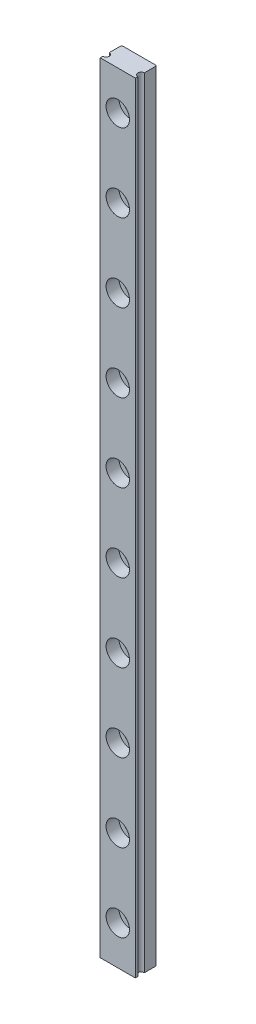
ISO-10303-21;
HEADER;
FILE_DESCRIPTION(('STEP AP214'),'2;1');
FILE_NAME('part.step','',(''),(''),'','','');
FILE_SCHEMA(('AUTOMOTIVE_DESIGN { 1 0 10303 214 1 1 1 1 }'));
ENDSEC;
DATA;
#1=APPLICATION_CONTEXT('core data for automotive mechanical design processes');
#2=APPLICATION_PROTOCOL_DEFINITION('international standard','automotive_design',2000,#1);
#3=PRODUCT_CONTEXT('',#1,'mechanical');
#4=PRODUCT('Part','Part','',(#3));
#5=PRODUCT_RELATED_PRODUCT_CATEGORY('part','',(#4));
#6=PRODUCT_DEFINITION_FORMATION('','',#4);
#7=PRODUCT_DEFINITION_CONTEXT('part definition',#1,'design');
#8=PRODUCT_DEFINITION('design','',#6,#7);
#9=PRODUCT_DEFINITION_SHAPE('','',#8);
#10=(LENGTH_UNIT() NAMED_UNIT(*) SI_UNIT(.MILLI.,.METRE.));
#11=(NAMED_UNIT(*) PLANE_ANGLE_UNIT() SI_UNIT($,.RADIAN.));
#12=(NAMED_UNIT(*) SI_UNIT($,.STERADIAN.) SOLID_ANGLE_UNIT());
#13=UNCERTAINTY_MEASURE_WITH_UNIT(LENGTH_MEASURE(1.E-05),#10,'distance_accuracy_value','');
#14=(GEOMETRIC_REPRESENTATION_CONTEXT(3) GLOBAL_UNCERTAINTY_ASSIGNED_CONTEXT((#13)) GLOBAL_UNIT_ASSIGNED_CONTEXT((#10,
#11,#12)) REPRESENTATION_CONTEXT('',''));
#15=CARTESIAN_POINT('',(0.,0.,0.));
#16=DIRECTION('',(0.,0.,1.));
#17=DIRECTION('',(1.,0.,0.));
#18=AXIS2_PLACEMENT_3D('',#15,#16,#17);
#19=CARTESIAN_POINT('',(-4.5,-120.,5.1625));
#20=DIRECTION('',(-1.,0.,0.));
#21=DIRECTION('',(0.,0.,1.));
#22=AXIS2_PLACEMENT_3D('',#19,#20,#21);
#23=PLANE('',#22);
#24=DIRECTION('',(0.,1.,0.));
#25=VECTOR('',#24,1.);
#26=CARTESIAN_POINT('',(-4.5,-120.,5.5));
#27=LINE('',#26,#25);
#28=CARTESIAN_POINT('',(-4.5,-120.,5.5));
#29=VERTEX_POINT('',#28);
#30=CARTESIAN_POINT('',(-4.5,80.,5.5));
#31=VERTEX_POINT('',#30);
#32=EDGE_CURVE('E287',#29,#31,#27,.T.);
#33=ORIENTED_EDGE('',*,*,#32,.T.);
#34=DIRECTION('',(0.,0.,-1.));
#35=VECTOR('',#34,1.);
#36=CARTESIAN_POINT('',(-4.5,80.,5.1625));
#37=LINE('',#36,#35);
#38=CARTESIAN_POINT('',(-4.5,80.,4.825));
#39=VERTEX_POINT('',#38);
#40=EDGE_CURVE('E325',#31,#39,#37,.T.);
#41=ORIENTED_EDGE('',*,*,#40,.T.);
#42=DIRECTION('',(0.,1.,0.));
#43=VECTOR('',#42,1.);
#44=CARTESIAN_POINT('',(-4.5,-120.,4.825));
#45=LINE('',#44,#43);
#46=CARTESIAN_POINT('',(-4.5,-120.,4.825));
#47=VERTEX_POINT('',#46);
#48=EDGE_CURVE('E214',#47,#39,#45,.T.);
#49=ORIENTED_EDGE('',*,*,#48,.F.);
#50=DIRECTION('',(0.,0.,-1.));
#51=VECTOR('',#50,1.);
#52=CARTESIAN_POINT('',(-4.5,-120.,5.1625));
#53=LINE('',#52,#51);
#54=EDGE_CURVE('E286',#29,#47,#53,.T.);
#55=ORIENTED_EDGE('',*,*,#54,.F.);
#56=EDGE_LOOP('',(#33,#41,#49,#55));
#57=FACE_BOUND('',#56,.T.);
#58=ADVANCED_FACE('F36',(#57),#23,.T.);
#59=CARTESIAN_POINT('',(-4.5,-120.,4.));
#60=DIRECTION('',(0.,1.,0.));
#61=DIRECTION('',(0.,0.,1.));
#62=AXIS2_PLACEMENT_3D('',#59,#60,#61);
#63=CYLINDRICAL_SURFACE('',#62,0.825);
#64=CARTESIAN_POINT('',(-4.5,80.,4.));
#65=DIRECTION('',(0.,1.,0.));
#66=DIRECTION('',(0.,0.,1.));
#67=AXIS2_PLACEMENT_3D('',#64,#65,#66);
#68=CIRCLE('',#67,0.825);
#69=CARTESIAN_POINT('',(-4.5,80.,3.175));
#70=VERTEX_POINT('',#69);
#71=EDGE_CURVE('E350',#70,#39,#68,.F.);
#72=ORIENTED_EDGE('',*,*,#71,.F.);
#73=DIRECTION('',(0.,1.,0.));
#74=VECTOR('',#73,1.);
#75=CARTESIAN_POINT('',(-4.5,-120.,3.175));
#76=LINE('',#75,#74);
#77=CARTESIAN_POINT('',(-4.5,-120.,3.175));
#78=VERTEX_POINT('',#77);
#79=EDGE_CURVE('E320',#78,#70,#76,.T.);
#80=ORIENTED_EDGE('',*,*,#79,.F.);
#81=CARTESIAN_POINT('',(-4.5,-120.,4.));
#82=DIRECTION('',(0.,1.,0.));
#83=DIRECTION('',(0.,0.,-1.));
#84=AXIS2_PLACEMENT_3D('',#81,#82,#83);
#85=CIRCLE('',#84,0.825);
#86=EDGE_CURVE('E292',#47,#78,#85,.T.);
#87=ORIENTED_EDGE('',*,*,#86,.F.);
#88=ORIENTED_EDGE('',*,*,#48,.T.);
#89=EDGE_LOOP('',(#72,#80,#87,#88));
#90=FACE_BOUND('',#89,.T.);
#91=ADVANCED_FACE('F409',(#90),#63,.F.);
#92=CARTESIAN_POINT('',(-4.5,-120.,1.7125));
#93=DIRECTION('',(-1.,0.,0.));
#94=DIRECTION('',(0.,0.,1.));
#95=AXIS2_PLACEMENT_3D('',#92,#93,#94);
#96=PLANE('',#95);
#97=ORIENTED_EDGE('',*,*,#79,.T.);
#98=DIRECTION('',(0.,0.,-1.));
#99=VECTOR('',#98,1.);
#100=CARTESIAN_POINT('',(-4.5,80.,1.7125));
#101=LINE('',#100,#99);
#102=CARTESIAN_POINT('',(-4.5,80.,0.249999999999999));
#103=VERTEX_POINT('',#102);
#104=EDGE_CURVE('E353',#70,#103,#101,.T.);
#105=ORIENTED_EDGE('',*,*,#104,.T.);
#106=DIRECTION('',(0.,1.,0.));
#107=VECTOR('',#106,1.);
#108=CARTESIAN_POINT('',(-4.5,-120.,0.25));
#109=LINE('',#108,#107);
#110=CARTESIAN_POINT('',(-4.5,-120.,0.25));
#111=VERTEX_POINT('',#110);
#112=EDGE_CURVE('E295',#111,#103,#109,.T.);
#113=ORIENTED_EDGE('',*,*,#112,.F.);
#114=DIRECTION('',(0.,0.,-1.));
#115=VECTOR('',#114,1.);
#116=CARTESIAN_POINT('',(-4.5,-120.,1.7125));
#117=LINE('',#116,#115);
#118=EDGE_CURVE('E296',#78,#111,#117,.T.);
#119=ORIENTED_EDGE('',*,*,#118,.F.);
#120=EDGE_LOOP('',(#97,#105,#113,#119));
#121=FACE_BOUND('',#120,.T.);
#122=ADVANCED_FACE('F403',(#121),#96,.T.);
#123=CARTESIAN_POINT('',(-4.375,-120.,0.125));
#124=DIRECTION('',(-0.707106781186548,0.,-0.707106781186547));
#125=DIRECTION('',(-0.707106781186547,0.,0.707106781186548));
#126=AXIS2_PLACEMENT_3D('',#123,#124,#125);
#127=PLANE('',#126);
#128=ORIENTED_EDGE('',*,*,#112,.T.);
#129=DIRECTION('',(0.707106781186547,0.,-0.707106781186548));
#130=VECTOR('',#129,1.);
#131=CARTESIAN_POINT('',(-4.375,80.,0.125));
#132=LINE('',#131,#130);
#133=CARTESIAN_POINT('',(-4.25,80.,0.));
#134=VERTEX_POINT('',#133);
#135=EDGE_CURVE('E356',#103,#134,#132,.T.);
#136=ORIENTED_EDGE('',*,*,#135,.T.);
#137=DIRECTION('',(0.,1.,0.));
#138=VECTOR('',#137,1.);
#139=CARTESIAN_POINT('',(-4.25,-120.,0.));
#140=LINE('',#139,#138);
#141=CARTESIAN_POINT('',(-4.25,-120.,0.));
#142=VERTEX_POINT('',#141);
#143=EDGE_CURVE('E230',#142,#134,#140,.T.);
#144=ORIENTED_EDGE('',*,*,#143,.F.);
#145=DIRECTION('',(0.707106781186547,0.,-0.707106781186548));
#146=VECTOR('',#145,1.);
#147=CARTESIAN_POINT('',(-4.375,-120.,0.125));
#148=LINE('',#147,#146);
#149=EDGE_CURVE('E293',#111,#142,#148,.T.);
#150=ORIENTED_EDGE('',*,*,#149,.F.);
#151=EDGE_LOOP('',(#128,#136,#144,#150));
#152=FACE_BOUND('',#151,.T.);
#153=ADVANCED_FACE('F397',(#152),#127,.T.);
#154=CARTESIAN_POINT('',(2.25,-120.,5.5));
#155=DIRECTION('',(0.,0.,1.));
#156=DIRECTION('',(1.,0.,0.));
#157=AXIS2_PLACEMENT_3D('',#154,#155,#156);
#158=PLANE('',#157);
#159=CARTESIAN_POINT('',(0.,70.,5.5));
#160=DIRECTION('',(0.,0.,-1.));
#161=DIRECTION('',(-1.,0.,0.));
#162=AXIS2_PLACEMENT_3D('',#159,#160,#161);
#163=CIRCLE('',#162,3.);
#164=CARTESIAN_POINT('',(-3.,70.,5.5));
#165=VERTEX_POINT('',#164);
#166=EDGE_CURVE('E315',#165,#165,#163,.T.);
#167=ORIENTED_EDGE('',*,*,#166,.T.);
#168=EDGE_LOOP('',(#167));
#169=FACE_BOUND('',#168,.T.);
#170=CARTESIAN_POINT('',(0.,50.,5.5));
#171=DIRECTION('',(0.,0.,-1.));
#172=DIRECTION('',(-1.,0.,0.));
#173=AXIS2_PLACEMENT_3D('',#170,#171,#172);
#174=CIRCLE('',#173,3.);
#175=CARTESIAN_POINT('',(-3.,50.,5.5));
#176=VERTEX_POINT('',#175);
#177=EDGE_CURVE('E218',#176,#176,#174,.T.);
#178=ORIENTED_EDGE('',*,*,#177,.T.);
#179=EDGE_LOOP('',(#178));
#180=FACE_BOUND('',#179,.T.);
#181=CARTESIAN_POINT('',(0.,30.,5.5));
#182=DIRECTION('',(0.,0.,-1.));
#183=DIRECTION('',(-1.,0.,0.));
#184=AXIS2_PLACEMENT_3D('',#181,#182,#183);
#185=CIRCLE('',#184,3.);
#186=CARTESIAN_POINT('',(-3.,30.,5.5));
#187=VERTEX_POINT('',#186);
#188=EDGE_CURVE('E210',#187,#187,#185,.T.);
#189=ORIENTED_EDGE('',*,*,#188,.T.);
#190=EDGE_LOOP('',(#189));
#191=FACE_BOUND('',#190,.T.);
#192=CARTESIAN_POINT('',(0.,10.,5.5));
#193=DIRECTION('',(0.,0.,-1.));
#194=DIRECTION('',(-1.,0.,0.));
#195=AXIS2_PLACEMENT_3D('',#192,#193,#194);
#196=CIRCLE('',#195,3.);
#197=CARTESIAN_POINT('',(-3.,10.,5.5));
#198=VERTEX_POINT('',#197);
#199=EDGE_CURVE('E208',#198,#198,#196,.T.);
#200=ORIENTED_EDGE('',*,*,#199,.T.);
#201=EDGE_LOOP('',(#200));
#202=FACE_BOUND('',#201,.T.);
#203=CARTESIAN_POINT('',(0.,-10.,5.5));
#204=DIRECTION('',(0.,0.,-1.));
#205=DIRECTION('',(-1.,0.,0.));
#206=AXIS2_PLACEMENT_3D('',#203,#204,#205);
#207=CIRCLE('',#206,3.);
#208=CARTESIAN_POINT('',(-3.,-10.,5.5));
#209=VERTEX_POINT('',#208);
#210=EDGE_CURVE('E276',#209,#209,#207,.T.);
#211=ORIENTED_EDGE('',*,*,#210,.T.);
#212=EDGE_LOOP('',(#211));
#213=FACE_BOUND('',#212,.T.);
#214=CARTESIAN_POINT('',(0.,-30.,5.5));
#215=DIRECTION('',(0.,0.,-1.));
#216=DIRECTION('',(-1.,0.,0.));
#217=AXIS2_PLACEMENT_3D('',#214,#215,#216);
#218=CIRCLE('',#217,3.);
#219=CARTESIAN_POINT('',(-3.,-30.,5.5));
#220=VERTEX_POINT('',#219);
#221=EDGE_CURVE('E267',#220,#220,#218,.T.);
#222=ORIENTED_EDGE('',*,*,#221,.T.);
#223=EDGE_LOOP('',(#222));
#224=FACE_BOUND('',#223,.T.);
#225=CARTESIAN_POINT('',(0.,-50.,5.5));
#226=DIRECTION('',(0.,0.,-1.));
#227=DIRECTION('',(-1.,0.,0.));
#228=AXIS2_PLACEMENT_3D('',#225,#226,#227);
#229=CIRCLE('',#228,3.);
#230=CARTESIAN_POINT('',(-3.,-50.,5.5));
#231=VERTEX_POINT('',#230);
#232=EDGE_CURVE('E262',#231,#231,#229,.T.);
#233=ORIENTED_EDGE('',*,*,#232,.T.);
#234=EDGE_LOOP('',(#233));
#235=FACE_BOUND('',#234,.T.);
#236=CARTESIAN_POINT('',(0.,-70.,5.5));
#237=DIRECTION('',(0.,0.,-1.));
#238=DIRECTION('',(-1.,0.,0.));
#239=AXIS2_PLACEMENT_3D('',#236,#237,#238);
#240=CIRCLE('',#239,3.);
#241=CARTESIAN_POINT('',(-3.,-70.,5.5));
#242=VERTEX_POINT('',#241);
#243=EDGE_CURVE('E246',#242,#242,#240,.T.);
#244=ORIENTED_EDGE('',*,*,#243,.T.);
#245=EDGE_LOOP('',(#244));
#246=FACE_BOUND('',#245,.T.);
#247=CARTESIAN_POINT('',(0.,-90.,5.5));
#248=DIRECTION('',(0.,0.,-1.));
#249=DIRECTION('',(-1.,0.,0.));
#250=AXIS2_PLACEMENT_3D('',#247,#248,#249);
#251=CIRCLE('',#250,3.);
#252=CARTESIAN_POINT('',(-3.,-90.,5.5));
#253=VERTEX_POINT('',#252);
#254=EDGE_CURVE('E240',#253,#253,#251,.T.);
#255=ORIENTED_EDGE('',*,*,#254,.T.);
#256=EDGE_LOOP('',(#255));
#257=FACE_BOUND('',#256,.T.);
#258=CARTESIAN_POINT('',(0.,-110.,5.5));
#259=DIRECTION('',(0.,0.,-1.));
#260=DIRECTION('',(-1.,0.,0.));
#261=AXIS2_PLACEMENT_3D('',#258,#259,#260);
#262=CIRCLE('',#261,3.);
#263=CARTESIAN_POINT('',(-3.,-110.,5.5));
#264=VERTEX_POINT('',#263);
#265=EDGE_CURVE('E257',#264,#264,#262,.T.);
#266=ORIENTED_EDGE('',*,*,#265,.T.);
#267=EDGE_LOOP('',(#266));
#268=FACE_BOUND('',#267,.T.);
#269=DIRECTION('',(0.,1.,0.));
#270=VECTOR('',#269,1.);
#271=CARTESIAN_POINT('',(4.5,-120.,5.5));
#272=LINE('',#271,#270);
#273=CARTESIAN_POINT('',(4.5,-120.,5.5));
#274=VERTEX_POINT('',#273);
#275=CARTESIAN_POINT('',(4.5,80.,5.5));
#276=VERTEX_POINT('',#275);
#277=EDGE_CURVE('E258',#274,#276,#272,.T.);
#278=ORIENTED_EDGE('',*,*,#277,.T.);
#279=DIRECTION('',(-1.,0.,0.));
#280=VECTOR('',#279,1.);
#281=CARTESIAN_POINT('',(2.25,80.,5.5));
#282=LINE('',#281,#280);
#283=EDGE_CURVE('E359',#276,#31,#282,.T.);
#284=ORIENTED_EDGE('',*,*,#283,.T.);
#285=ORIENTED_EDGE('',*,*,#32,.F.);
#286=DIRECTION('',(1.,0.,0.));
#287=VECTOR('',#286,1.);
#288=CARTESIAN_POINT('',(2.25,-120.,5.5));
#289=LINE('',#288,#287);
#290=EDGE_CURVE('E284',#29,#274,#289,.T.);
#291=ORIENTED_EDGE('',*,*,#290,.T.);
#292=EDGE_LOOP('',(#278,#284,#285,#291));
#293=FACE_BOUND('',#292,.T.);
#294=ADVANCED_FACE('F418',(#169,#180,#191,#202,#213,#224,#235,#246,#257,#268,#293),#158,.T.);
#295=CARTESIAN_POINT('',(4.5,-120.,5.1625));
#296=DIRECTION('',(1.,0.,0.));
#297=DIRECTION('',(0.,1.,0.));
#298=AXIS2_PLACEMENT_3D('',#295,#296,#297);
#299=PLANE('',#298);
#300=DIRECTION('',(0.,1.,0.));
#301=VECTOR('',#300,1.);
#302=CARTESIAN_POINT('',(4.5,-120.,4.825));
#303=LINE('',#302,#301);
#304=CARTESIAN_POINT('',(4.5,-120.,4.825));
#305=VERTEX_POINT('',#304);
#306=CARTESIAN_POINT('',(4.5,80.,4.825));
#307=VERTEX_POINT('',#306);
#308=EDGE_CURVE('E300',#305,#307,#303,.T.);
#309=ORIENTED_EDGE('',*,*,#308,.T.);
#310=DIRECTION('',(0.,0.,1.));
#311=VECTOR('',#310,1.);
#312=CARTESIAN_POINT('',(4.5,80.,5.1625));
#313=LINE('',#312,#311);
#314=EDGE_CURVE('E362',#307,#276,#313,.T.);
#315=ORIENTED_EDGE('',*,*,#314,.T.);
#316=ORIENTED_EDGE('',*,*,#277,.F.);
#317=DIRECTION('',(0.,0.,-1.));
#318=VECTOR('',#317,1.);
#319=CARTESIAN_POINT('',(4.5,-120.,5.1625));
#320=LINE('',#319,#318);
#321=EDGE_CURVE('E255',#274,#305,#320,.T.);
#322=ORIENTED_EDGE('',*,*,#321,.T.);
#323=EDGE_LOOP('',(#309,#315,#316,#322));
#324=FACE_BOUND('',#323,.T.);
#325=ADVANCED_FACE('F424',(#324),#299,.T.);
#326=CARTESIAN_POINT('',(4.5,-120.,4.));
#327=DIRECTION('',(0.,1.,0.));
#328=DIRECTION('',(0.,0.,1.));
#329=AXIS2_PLACEMENT_3D('',#326,#327,#328);
#330=CYLINDRICAL_SURFACE('',#329,0.825);
#331=CARTESIAN_POINT('',(4.5,80.,4.));
#332=DIRECTION('',(0.,1.,0.));
#333=DIRECTION('',(0.,0.,1.));
#334=AXIS2_PLACEMENT_3D('',#331,#332,#333);
#335=CIRCLE('',#334,0.825);
#336=CARTESIAN_POINT('',(4.5,80.,3.175));
#337=VERTEX_POINT('',#336);
#338=EDGE_CURVE('E365',#307,#337,#335,.F.);
#339=ORIENTED_EDGE('',*,*,#338,.F.);
#340=ORIENTED_EDGE('',*,*,#308,.F.);
#341=CARTESIAN_POINT('',(4.5,-120.,4.));
#342=DIRECTION('',(0.,-1.,0.));
#343=DIRECTION('',(0.,0.,-1.));
#344=AXIS2_PLACEMENT_3D('',#341,#342,#343);
#345=CIRCLE('',#344,0.825);
#346=CARTESIAN_POINT('',(4.5,-120.,3.175));
#347=VERTEX_POINT('',#346);
#348=EDGE_CURVE('E275',#305,#347,#345,.T.);
#349=ORIENTED_EDGE('',*,*,#348,.T.);
#350=DIRECTION('',(0.,1.,0.));
#351=VECTOR('',#350,1.);
#352=CARTESIAN_POINT('',(4.5,-120.,3.175));
#353=LINE('',#352,#351);
#354=EDGE_CURVE('E306',#347,#337,#353,.T.);
#355=ORIENTED_EDGE('',*,*,#354,.T.);
#356=EDGE_LOOP('',(#339,#340,#349,#355));
#357=FACE_BOUND('',#356,.T.);
#358=ADVANCED_FACE('F429',(#357),#330,.F.);
#359=CARTESIAN_POINT('',(4.5,-120.,1.7125));
#360=DIRECTION('',(1.,0.,0.));
#361=DIRECTION('',(0.,1.,0.));
#362=AXIS2_PLACEMENT_3D('',#359,#360,#361);
#363=PLANE('',#362);
#364=DIRECTION('',(0.,1.,0.));
#365=VECTOR('',#364,1.);
#366=CARTESIAN_POINT('',(4.5,-120.,0.25));
#367=LINE('',#366,#365);
#368=CARTESIAN_POINT('',(4.5,-120.,0.25));
#369=VERTEX_POINT('',#368);
#370=CARTESIAN_POINT('',(4.5,80.,0.249999999999999));
#371=VERTEX_POINT('',#370);
#372=EDGE_CURVE('E269',#369,#371,#367,.T.);
#373=ORIENTED_EDGE('',*,*,#372,.T.);
#374=DIRECTION('',(0.,0.,1.));
#375=VECTOR('',#374,1.);
#376=CARTESIAN_POINT('',(4.5,80.,1.7125));
#377=LINE('',#376,#375);
#378=EDGE_CURVE('E368',#371,#337,#377,.T.);
#379=ORIENTED_EDGE('',*,*,#378,.T.);
#380=ORIENTED_EDGE('',*,*,#354,.F.);
#381=DIRECTION('',(0.,0.,-1.));
#382=VECTOR('',#381,1.);
#383=CARTESIAN_POINT('',(4.5,-120.,1.7125));
#384=LINE('',#383,#382);
#385=EDGE_CURVE('E303',#347,#369,#384,.T.);
#386=ORIENTED_EDGE('',*,*,#385,.T.);
#387=EDGE_LOOP('',(#373,#379,#380,#386));
#388=FACE_BOUND('',#387,.T.);
#389=ADVANCED_FACE('F378',(#388),#363,.T.);
#390=CARTESIAN_POINT('',(4.375,-120.,0.125));
#391=DIRECTION('',(0.707106781186548,0.,-0.707106781186547));
#392=DIRECTION('',(0.,-1.,0.));
#393=AXIS2_PLACEMENT_3D('',#390,#391,#392);
#394=PLANE('',#393);
#395=DIRECTION('',(0.,1.,0.));
#396=VECTOR('',#395,1.);
#397=CARTESIAN_POINT('',(4.25,-120.,0.));
#398=LINE('',#397,#396);
#399=CARTESIAN_POINT('',(4.25,-120.,0.));
#400=VERTEX_POINT('',#399);
#401=CARTESIAN_POINT('',(4.25,80.,0.));
#402=VERTEX_POINT('',#401);
#403=EDGE_CURVE('E223',#400,#402,#398,.T.);
#404=ORIENTED_EDGE('',*,*,#403,.T.);
#405=DIRECTION('',(0.707106781186547,0.,0.707106781186548));
#406=VECTOR('',#405,1.);
#407=CARTESIAN_POINT('',(4.375,80.,0.125));
#408=LINE('',#407,#406);
#409=EDGE_CURVE('E51',#402,#371,#408,.T.);
#410=ORIENTED_EDGE('',*,*,#409,.T.);
#411=ORIENTED_EDGE('',*,*,#372,.F.);
#412=DIRECTION('',(-0.707106781186547,0.,-0.707106781186548));
#413=VECTOR('',#412,1.);
#414=CARTESIAN_POINT('',(4.375,-120.,0.125));
#415=LINE('',#414,#413);
#416=EDGE_CURVE('E272',#369,#400,#415,.T.);
#417=ORIENTED_EDGE('',*,*,#416,.T.);
#418=EDGE_LOOP('',(#404,#410,#411,#417));
#419=FACE_BOUND('',#418,.T.);
#420=ADVANCED_FACE('F373',(#419),#394,.T.);
#421=CARTESIAN_POINT('',(2.125,-120.,0.));
#422=DIRECTION('',(0.,0.,-1.));
#423=DIRECTION('',(0.,-1.,0.));
#424=AXIS2_PLACEMENT_3D('',#421,#422,#423);
#425=PLANE('',#424);
#426=CARTESIAN_POINT('',(0.,70.,0.));
#427=DIRECTION('',(0.,0.,1.));
#428=DIRECTION('',(-1.,0.,0.));
#429=AXIS2_PLACEMENT_3D('',#426,#427,#428);
#430=CIRCLE('',#429,1.75);
#431=CARTESIAN_POINT('',(-1.75,70.,0.));
#432=VERTEX_POINT('',#431);
#433=EDGE_CURVE('E219',#432,#432,#430,.T.);
#434=ORIENTED_EDGE('',*,*,#433,.T.);
#435=EDGE_LOOP('',(#434));
#436=FACE_BOUND('',#435,.T.);
#437=CARTESIAN_POINT('',(0.,50.,0.));
#438=DIRECTION('',(0.,0.,1.));
#439=DIRECTION('',(-1.,0.,0.));
#440=AXIS2_PLACEMENT_3D('',#437,#438,#439);
#441=CIRCLE('',#440,1.75);
#442=CARTESIAN_POINT('',(-1.75,50.,0.));
#443=VERTEX_POINT('',#442);
#444=EDGE_CURVE('E220',#443,#443,#441,.T.);
#445=ORIENTED_EDGE('',*,*,#444,.T.);
#446=EDGE_LOOP('',(#445));
#447=FACE_BOUND('',#446,.T.);
#448=CARTESIAN_POINT('',(0.,30.,0.));
#449=DIRECTION('',(0.,0.,1.));
#450=DIRECTION('',(-1.,0.,0.));
#451=AXIS2_PLACEMENT_3D('',#448,#449,#450);
#452=CIRCLE('',#451,1.75);
#453=CARTESIAN_POINT('',(-1.75,30.,0.));
#454=VERTEX_POINT('',#453);
#455=EDGE_CURVE('E201',#454,#454,#452,.T.);
#456=ORIENTED_EDGE('',*,*,#455,.T.);
#457=EDGE_LOOP('',(#456));
#458=FACE_BOUND('',#457,.T.);
#459=CARTESIAN_POINT('',(0.,10.,0.));
#460=DIRECTION('',(0.,0.,1.));
#461=DIRECTION('',(-1.,0.,0.));
#462=AXIS2_PLACEMENT_3D('',#459,#460,#461);
#463=CIRCLE('',#462,1.75);
#464=CARTESIAN_POINT('',(-1.75,10.,0.));
#465=VERTEX_POINT('',#464);
#466=EDGE_CURVE('E305',#465,#465,#463,.T.);
#467=ORIENTED_EDGE('',*,*,#466,.T.);
#468=EDGE_LOOP('',(#467));
#469=FACE_BOUND('',#468,.T.);
#470=CARTESIAN_POINT('',(0.,-10.,0.));
#471=DIRECTION('',(0.,0.,1.));
#472=DIRECTION('',(-1.,0.,0.));
#473=AXIS2_PLACEMENT_3D('',#470,#471,#472);
#474=CIRCLE('',#473,1.75);
#475=CARTESIAN_POINT('',(-1.75,-10.,0.));
#476=VERTEX_POINT('',#475);
#477=EDGE_CURVE('E268',#476,#476,#474,.T.);
#478=ORIENTED_EDGE('',*,*,#477,.T.);
#479=EDGE_LOOP('',(#478));
#480=FACE_BOUND('',#479,.T.);
#481=CARTESIAN_POINT('',(0.,-30.,0.));
#482=DIRECTION('',(0.,0.,1.));
#483=DIRECTION('',(-1.,0.,0.));
#484=AXIS2_PLACEMENT_3D('',#481,#482,#483);
#485=CIRCLE('',#484,1.75);
#486=CARTESIAN_POINT('',(-1.75,-30.,0.));
#487=VERTEX_POINT('',#486);
#488=EDGE_CURVE('E250',#487,#487,#485,.T.);
#489=ORIENTED_EDGE('',*,*,#488,.T.);
#490=EDGE_LOOP('',(#489));
#491=FACE_BOUND('',#490,.T.);
#492=CARTESIAN_POINT('',(0.,-50.,0.));
#493=DIRECTION('',(0.,0.,1.));
#494=DIRECTION('',(-1.,0.,0.));
#495=AXIS2_PLACEMENT_3D('',#492,#493,#494);
#496=CIRCLE('',#495,1.75);
#497=CARTESIAN_POINT('',(-1.75,-50.,0.));
#498=VERTEX_POINT('',#497);
#499=EDGE_CURVE('E326',#498,#498,#496,.T.);
#500=ORIENTED_EDGE('',*,*,#499,.T.);
#501=EDGE_LOOP('',(#500));
#502=FACE_BOUND('',#501,.T.);
#503=CARTESIAN_POINT('',(0.,-70.,0.));
#504=DIRECTION('',(0.,0.,1.));
#505=DIRECTION('',(-1.,0.,0.));
#506=AXIS2_PLACEMENT_3D('',#503,#504,#505);
#507=CIRCLE('',#506,1.75);
#508=CARTESIAN_POINT('',(-1.75,-70.,0.));
#509=VERTEX_POINT('',#508);
#510=EDGE_CURVE('E307',#509,#509,#507,.T.);
#511=ORIENTED_EDGE('',*,*,#510,.T.);
#512=EDGE_LOOP('',(#511));
#513=FACE_BOUND('',#512,.T.);
#514=CARTESIAN_POINT('',(0.,-90.,0.));
#515=DIRECTION('',(0.,0.,1.));
#516=DIRECTION('',(-1.,0.,0.));
#517=AXIS2_PLACEMENT_3D('',#514,#515,#516);
#518=CIRCLE('',#517,1.75);
#519=CARTESIAN_POINT('',(-1.75,-90.,0.));
#520=VERTEX_POINT('',#519);
#521=EDGE_CURVE('E232',#520,#520,#518,.T.);
#522=ORIENTED_EDGE('',*,*,#521,.T.);
#523=EDGE_LOOP('',(#522));
#524=FACE_BOUND('',#523,.T.);
#525=CARTESIAN_POINT('',(0.,-110.,0.));
#526=DIRECTION('',(0.,0.,1.));
#527=DIRECTION('',(-1.,0.,0.));
#528=AXIS2_PLACEMENT_3D('',#525,#526,#527);
#529=CIRCLE('',#528,1.75);
#530=CARTESIAN_POINT('',(-1.75,-110.,0.));
#531=VERTEX_POINT('',#530);
#532=EDGE_CURVE('E226',#531,#531,#529,.T.);
#533=ORIENTED_EDGE('',*,*,#532,.T.);
#534=EDGE_LOOP('',(#533));
#535=FACE_BOUND('',#534,.T.);
#536=ORIENTED_EDGE('',*,*,#143,.T.);
#537=DIRECTION('',(1.,0.,0.));
#538=VECTOR('',#537,1.);
#539=CARTESIAN_POINT('',(2.125,80.,0.));
#540=LINE('',#539,#538);
#541=EDGE_CURVE('E11',#134,#402,#540,.T.);
#542=ORIENTED_EDGE('',*,*,#541,.T.);
#543=ORIENTED_EDGE('',*,*,#403,.F.);
#544=DIRECTION('',(-1.,0.,0.));
#545=VECTOR('',#544,1.);
#546=CARTESIAN_POINT('',(2.125,-120.,0.));
#547=LINE('',#546,#545);
#548=EDGE_CURVE('E225',#400,#142,#547,.T.);
#549=ORIENTED_EDGE('',*,*,#548,.T.);
#550=EDGE_LOOP('',(#536,#542,#543,#549));
#551=FACE_BOUND('',#550,.T.);
#552=ADVANCED_FACE('F202',(#436,#447,#458,#469,#480,#491,#502,#513,#524,#535,#551),#425,.T.);
#553=CARTESIAN_POINT('',(0.,-110.,5.5));
#554=DIRECTION('',(0.,0.,-1.));
#555=DIRECTION('',(-1.,0.,0.));
#556=AXIS2_PLACEMENT_3D('',#553,#554,#555);
#557=CYLINDRICAL_SURFACE('',#556,3.);
#558=ORIENTED_EDGE('',*,*,#265,.F.);
#559=EDGE_LOOP('',(#558));
#560=FACE_BOUND('',#559,.T.);
#561=CARTESIAN_POINT('',(0.,-110.,2.2));
#562=DIRECTION('',(0.,0.,-1.));
#563=DIRECTION('',(-1.,0.,0.));
#564=AXIS2_PLACEMENT_3D('',#561,#562,#563);
#565=CIRCLE('',#564,3.);
#566=CARTESIAN_POINT('',(-3.,-110.,2.2));
#567=VERTEX_POINT('',#566);
#568=EDGE_CURVE('E44',#567,#567,#565,.T.);
#569=ORIENTED_EDGE('',*,*,#568,.T.);
#570=EDGE_LOOP('',(#569));
#571=FACE_BOUND('',#570,.T.);
#572=ADVANCED_FACE('F457',(#560,#571),#557,.F.);
#573=CARTESIAN_POINT('',(3.,-110.,2.2));
#574=DIRECTION('',(0.,0.,1.));
#575=DIRECTION('',(1.,0.,0.));
#576=AXIS2_PLACEMENT_3D('',#573,#574,#575);
#577=PLANE('',#576);
#578=ORIENTED_EDGE('',*,*,#568,.F.);
#579=EDGE_LOOP('',(#578));
#580=FACE_BOUND('',#579,.T.);
#581=CARTESIAN_POINT('',(0.,-110.,2.2));
#582=DIRECTION('',(0.,0.,-1.));
#583=DIRECTION('',(-1.,0.,0.));
#584=AXIS2_PLACEMENT_3D('',#581,#582,#583);
#585=CIRCLE('',#584,1.75);
#586=CARTESIAN_POINT('',(-1.75,-110.,2.2));
#587=VERTEX_POINT('',#586);
#588=EDGE_CURVE('E338',#587,#587,#585,.T.);
#589=ORIENTED_EDGE('',*,*,#588,.T.);
#590=EDGE_LOOP('',(#589));
#591=FACE_BOUND('',#590,.T.);
#592=ADVANCED_FACE('F464',(#580,#591),#577,.T.);
#593=CARTESIAN_POINT('',(0.,-110.,5.5));
#594=DIRECTION('',(0.,0.,-1.));
#595=DIRECTION('',(-1.,0.,0.));
#596=AXIS2_PLACEMENT_3D('',#593,#594,#595);
#597=CYLINDRICAL_SURFACE('',#596,1.75);
#598=ORIENTED_EDGE('',*,*,#588,.F.);
#599=EDGE_LOOP('',(#598));
#600=FACE_BOUND('',#599,.T.);
#601=ORIENTED_EDGE('',*,*,#532,.F.);
#602=EDGE_LOOP('',(#601));
#603=FACE_BOUND('',#602,.T.);
#604=ADVANCED_FACE('F499',(#600,#603),#597,.F.);
#605=CARTESIAN_POINT('',(2.25,-120.,2.75));
#606=DIRECTION('',(0.,-1.,0.));
#607=DIRECTION('',(0.,0.,-1.));
#608=AXIS2_PLACEMENT_3D('',#605,#606,#607);
#609=PLANE('',#608);
#610=ORIENTED_EDGE('',*,*,#290,.F.);
#611=ORIENTED_EDGE('',*,*,#54,.T.);
#612=ORIENTED_EDGE('',*,*,#86,.T.);
#613=ORIENTED_EDGE('',*,*,#118,.T.);
#614=ORIENTED_EDGE('',*,*,#149,.T.);
#615=ORIENTED_EDGE('',*,*,#548,.F.);
#616=ORIENTED_EDGE('',*,*,#416,.F.);
#617=ORIENTED_EDGE('',*,*,#385,.F.);
#618=ORIENTED_EDGE('',*,*,#348,.F.);
#619=ORIENTED_EDGE('',*,*,#321,.F.);
#620=EDGE_LOOP('',(#610,#611,#612,#613,#614,#615,#616,#617,#618,#619));
#621=FACE_BOUND('',#620,.T.);
#622=ADVANCED_FACE('F386',(#621),#609,.T.);
#623=CARTESIAN_POINT('',(0.,-90.,5.5));
#624=DIRECTION('',(0.,0.,-1.));
#625=DIRECTION('',(-1.,0.,0.));
#626=AXIS2_PLACEMENT_3D('',#623,#624,#625);
#627=CYLINDRICAL_SURFACE('',#626,1.75);
#628=CARTESIAN_POINT('',(0.,-90.,2.2));
#629=DIRECTION('',(0.,0.,-1.));
#630=DIRECTION('',(-1.,0.,0.));
#631=AXIS2_PLACEMENT_3D('',#628,#629,#630);
#632=CIRCLE('',#631,1.75);
#633=CARTESIAN_POINT('',(-1.75,-90.,2.2));
#634=VERTEX_POINT('',#633);
#635=EDGE_CURVE('E236',#634,#634,#632,.T.);
#636=ORIENTED_EDGE('',*,*,#635,.F.);
#637=EDGE_LOOP('',(#636));
#638=FACE_BOUND('',#637,.T.);
#639=ORIENTED_EDGE('',*,*,#521,.F.);
#640=EDGE_LOOP('',(#639));
#641=FACE_BOUND('',#640,.T.);
#642=ADVANCED_FACE('F573',(#638,#641),#627,.F.);
#643=CARTESIAN_POINT('',(3.,-90.,2.2));
#644=DIRECTION('',(0.,0.,1.));
#645=DIRECTION('',(1.,0.,0.));
#646=AXIS2_PLACEMENT_3D('',#643,#644,#645);
#647=PLANE('',#646);
#648=CARTESIAN_POINT('',(0.,-90.,2.2));
#649=DIRECTION('',(0.,0.,-1.));
#650=DIRECTION('',(-1.,0.,0.));
#651=AXIS2_PLACEMENT_3D('',#648,#649,#650);
#652=CIRCLE('',#651,3.);
#653=CARTESIAN_POINT('',(-3.,-90.,2.2));
#654=VERTEX_POINT('',#653);
#655=EDGE_CURVE('E242',#654,#654,#652,.T.);
#656=ORIENTED_EDGE('',*,*,#655,.F.);
#657=EDGE_LOOP('',(#656));
#658=FACE_BOUND('',#657,.T.);
#659=ORIENTED_EDGE('',*,*,#635,.T.);
#660=EDGE_LOOP('',(#659));
#661=FACE_BOUND('',#660,.T.);
#662=ADVANCED_FACE('F493',(#658,#661),#647,.T.);
#663=CARTESIAN_POINT('',(0.,-90.,5.5));
#664=DIRECTION('',(0.,0.,-1.));
#665=DIRECTION('',(-1.,0.,0.));
#666=AXIS2_PLACEMENT_3D('',#663,#664,#665);
#667=CYLINDRICAL_SURFACE('',#666,3.);
#668=ORIENTED_EDGE('',*,*,#254,.F.);
#669=EDGE_LOOP('',(#668));
#670=FACE_BOUND('',#669,.T.);
#671=ORIENTED_EDGE('',*,*,#655,.T.);
#672=EDGE_LOOP('',(#671));
#673=FACE_BOUND('',#672,.T.);
#674=ADVANCED_FACE('F490',(#670,#673),#667,.F.);
#675=CARTESIAN_POINT('',(0.,-70.,5.5));
#676=DIRECTION('',(0.,0.,-1.));
#677=DIRECTION('',(-1.,0.,0.));
#678=AXIS2_PLACEMENT_3D('',#675,#676,#677);
#679=CYLINDRICAL_SURFACE('',#678,1.75);
#680=CARTESIAN_POINT('',(0.,-70.,2.2));
#681=DIRECTION('',(0.,0.,-1.));
#682=DIRECTION('',(-1.,0.,0.));
#683=AXIS2_PLACEMENT_3D('',#680,#681,#682);
#684=CIRCLE('',#683,1.75);
#685=CARTESIAN_POINT('',(-1.75,-70.,2.2));
#686=VERTEX_POINT('',#685);
#687=EDGE_CURVE('E248',#686,#686,#684,.T.);
#688=ORIENTED_EDGE('',*,*,#687,.F.);
#689=EDGE_LOOP('',(#688));
#690=FACE_BOUND('',#689,.T.);
#691=ORIENTED_EDGE('',*,*,#510,.F.);
#692=EDGE_LOOP('',(#691));
#693=FACE_BOUND('',#692,.T.);
#694=ADVANCED_FACE('F492',(#690,#693),#679,.F.);
#695=CARTESIAN_POINT('',(3.,-70.,2.2));
#696=DIRECTION('',(0.,0.,1.));
#697=DIRECTION('',(1.,0.,0.));
#698=AXIS2_PLACEMENT_3D('',#695,#696,#697);
#699=PLANE('',#698);
#700=CARTESIAN_POINT('',(0.,-70.,2.2));
#701=DIRECTION('',(0.,0.,-1.));
#702=DIRECTION('',(-1.,0.,0.));
#703=AXIS2_PLACEMENT_3D('',#700,#701,#702);
#704=CIRCLE('',#703,3.);
#705=CARTESIAN_POINT('',(-3.,-70.,2.2));
#706=VERTEX_POINT('',#705);
#707=EDGE_CURVE('E249',#706,#706,#704,.T.);
#708=ORIENTED_EDGE('',*,*,#707,.F.);
#709=EDGE_LOOP('',(#708));
#710=FACE_BOUND('',#709,.T.);
#711=ORIENTED_EDGE('',*,*,#687,.T.);
#712=EDGE_LOOP('',(#711));
#713=FACE_BOUND('',#712,.T.);
#714=ADVANCED_FACE('F530',(#710,#713),#699,.T.);
#715=CARTESIAN_POINT('',(0.,-70.,5.5));
#716=DIRECTION('',(0.,0.,-1.));
#717=DIRECTION('',(-1.,0.,0.));
#718=AXIS2_PLACEMENT_3D('',#715,#716,#717);
#719=CYLINDRICAL_SURFACE('',#718,3.);
#720=ORIENTED_EDGE('',*,*,#243,.F.);
#721=EDGE_LOOP('',(#720));
#722=FACE_BOUND('',#721,.T.);
#723=ORIENTED_EDGE('',*,*,#707,.T.);
#724=EDGE_LOOP('',(#723));
#725=FACE_BOUND('',#724,.T.);
#726=ADVANCED_FACE('F38',(#722,#725),#719,.F.);
#727=CARTESIAN_POINT('',(0.,-50.,5.5));
#728=DIRECTION('',(0.,0.,-1.));
#729=DIRECTION('',(-1.,0.,0.));
#730=AXIS2_PLACEMENT_3D('',#727,#728,#729);
#731=CYLINDRICAL_SURFACE('',#730,1.75);
#732=CARTESIAN_POINT('',(0.,-50.,2.2));
#733=DIRECTION('',(0.,0.,-1.));
#734=DIRECTION('',(-1.,0.,0.));
#735=AXIS2_PLACEMENT_3D('',#732,#733,#734);
#736=CIRCLE('',#735,1.75);
#737=CARTESIAN_POINT('',(-1.75,-50.,2.2));
#738=VERTEX_POINT('',#737);
#739=EDGE_CURVE('E264',#738,#738,#736,.T.);
#740=ORIENTED_EDGE('',*,*,#739,.F.);
#741=EDGE_LOOP('',(#740));
#742=FACE_BOUND('',#741,.T.);
#743=ORIENTED_EDGE('',*,*,#499,.F.);
#744=EDGE_LOOP('',(#743));
#745=FACE_BOUND('',#744,.T.);
#746=ADVANCED_FACE('F507',(#742,#745),#731,.F.);
#747=CARTESIAN_POINT('',(3.,-50.,2.2));
#748=DIRECTION('',(0.,0.,1.));
#749=DIRECTION('',(1.,0.,0.));
#750=AXIS2_PLACEMENT_3D('',#747,#748,#749);
#751=PLANE('',#750);
#752=CARTESIAN_POINT('',(0.,-50.,2.2));
#753=DIRECTION('',(0.,0.,-1.));
#754=DIRECTION('',(-1.,0.,0.));
#755=AXIS2_PLACEMENT_3D('',#752,#753,#754);
#756=CIRCLE('',#755,3.);
#757=CARTESIAN_POINT('',(-3.,-50.,2.2));
#758=VERTEX_POINT('',#757);
#759=EDGE_CURVE('E253',#758,#758,#756,.T.);
#760=ORIENTED_EDGE('',*,*,#759,.F.);
#761=EDGE_LOOP('',(#760));
#762=FACE_BOUND('',#761,.T.);
#763=ORIENTED_EDGE('',*,*,#739,.T.);
#764=EDGE_LOOP('',(#763));
#765=FACE_BOUND('',#764,.T.);
#766=ADVANCED_FACE('F510',(#762,#765),#751,.T.);
#767=CARTESIAN_POINT('',(0.,-50.,5.5));
#768=DIRECTION('',(0.,0.,-1.));
#769=DIRECTION('',(-1.,0.,0.));
#770=AXIS2_PLACEMENT_3D('',#767,#768,#769);
#771=CYLINDRICAL_SURFACE('',#770,3.);
#772=ORIENTED_EDGE('',*,*,#232,.F.);
#773=EDGE_LOOP('',(#772));
#774=FACE_BOUND('',#773,.T.);
#775=ORIENTED_EDGE('',*,*,#759,.T.);
#776=EDGE_LOOP('',(#775));
#777=FACE_BOUND('',#776,.T.);
#778=ADVANCED_FACE('F526',(#774,#777),#771,.F.);
#779=CARTESIAN_POINT('',(0.,-30.,5.5));
#780=DIRECTION('',(0.,0.,-1.));
#781=DIRECTION('',(-1.,0.,0.));
#782=AXIS2_PLACEMENT_3D('',#779,#780,#781);
#783=CYLINDRICAL_SURFACE('',#782,1.75);
#784=CARTESIAN_POINT('',(0.,-30.,2.2));
#785=DIRECTION('',(0.,0.,-1.));
#786=DIRECTION('',(-1.,0.,0.));
#787=AXIS2_PLACEMENT_3D('',#784,#785,#786);
#788=CIRCLE('',#787,1.75);
#789=CARTESIAN_POINT('',(-1.75,-30.,2.2));
#790=VERTEX_POINT('',#789);
#791=EDGE_CURVE('E254',#790,#790,#788,.T.);
#792=ORIENTED_EDGE('',*,*,#791,.F.);
#793=EDGE_LOOP('',(#792));
#794=FACE_BOUND('',#793,.T.);
#795=ORIENTED_EDGE('',*,*,#488,.F.);
#796=EDGE_LOOP('',(#795));
#797=FACE_BOUND('',#796,.T.);
#798=ADVANCED_FACE('F518',(#794,#797),#783,.F.);
#799=CARTESIAN_POINT('',(3.,-30.,2.2));
#800=DIRECTION('',(0.,0.,1.));
#801=DIRECTION('',(1.,0.,0.));
#802=AXIS2_PLACEMENT_3D('',#799,#800,#801);
#803=PLANE('',#802);
#804=CARTESIAN_POINT('',(0.,-30.,2.2));
#805=DIRECTION('',(0.,0.,-1.));
#806=DIRECTION('',(-1.,0.,0.));
#807=AXIS2_PLACEMENT_3D('',#804,#805,#806);
#808=CIRCLE('',#807,3.);
#809=CARTESIAN_POINT('',(-3.,-30.,2.2));
#810=VERTEX_POINT('',#809);
#811=EDGE_CURVE('E265',#810,#810,#808,.T.);
#812=ORIENTED_EDGE('',*,*,#811,.F.);
#813=EDGE_LOOP('',(#812));
#814=FACE_BOUND('',#813,.T.);
#815=ORIENTED_EDGE('',*,*,#791,.T.);
#816=EDGE_LOOP('',(#815));
#817=FACE_BOUND('',#816,.T.);
#818=ADVANCED_FACE('F514',(#814,#817),#803,.T.);
#819=CARTESIAN_POINT('',(0.,-30.,5.5));
#820=DIRECTION('',(0.,0.,-1.));
#821=DIRECTION('',(-1.,0.,0.));
#822=AXIS2_PLACEMENT_3D('',#819,#820,#821);
#823=CYLINDRICAL_SURFACE('',#822,3.);
#824=ORIENTED_EDGE('',*,*,#221,.F.);
#825=EDGE_LOOP('',(#824));
#826=FACE_BOUND('',#825,.T.);
#827=ORIENTED_EDGE('',*,*,#811,.T.);
#828=EDGE_LOOP('',(#827));
#829=FACE_BOUND('',#828,.T.);
#830=ADVANCED_FACE('F517',(#826,#829),#823,.F.);
#831=CARTESIAN_POINT('',(0.,-10.,5.5));
#832=DIRECTION('',(0.,0.,-1.));
#833=DIRECTION('',(-1.,0.,0.));
#834=AXIS2_PLACEMENT_3D('',#831,#832,#833);
#835=CYLINDRICAL_SURFACE('',#834,1.75);
#836=CARTESIAN_POINT('',(0.,-10.,2.2));
#837=DIRECTION('',(0.,0.,-1.));
#838=DIRECTION('',(-1.,0.,0.));
#839=AXIS2_PLACEMENT_3D('',#836,#837,#838);
#840=CIRCLE('',#839,1.75);
#841=CARTESIAN_POINT('',(-1.75,-10.,2.2));
#842=VERTEX_POINT('',#841);
#843=EDGE_CURVE('E278',#842,#842,#840,.T.);
#844=ORIENTED_EDGE('',*,*,#843,.F.);
#845=EDGE_LOOP('',(#844));
#846=FACE_BOUND('',#845,.T.);
#847=ORIENTED_EDGE('',*,*,#477,.F.);
#848=EDGE_LOOP('',(#847));
#849=FACE_BOUND('',#848,.T.);
#850=ADVANCED_FACE('F544',(#846,#849),#835,.F.);
#851=CARTESIAN_POINT('',(3.,-10.,2.2));
#852=DIRECTION('',(0.,0.,1.));
#853=DIRECTION('',(1.,0.,0.));
#854=AXIS2_PLACEMENT_3D('',#851,#852,#853);
#855=PLANE('',#854);
#856=CARTESIAN_POINT('',(0.,-10.,2.2));
#857=DIRECTION('',(0.,0.,-1.));
#858=DIRECTION('',(-1.,0.,0.));
#859=AXIS2_PLACEMENT_3D('',#856,#857,#858);
#860=CIRCLE('',#859,3.);
#861=CARTESIAN_POINT('',(-3.,-10.,2.2));
#862=VERTEX_POINT('',#861);
#863=EDGE_CURVE('E279',#862,#862,#860,.T.);
#864=ORIENTED_EDGE('',*,*,#863,.F.);
#865=EDGE_LOOP('',(#864));
#866=FACE_BOUND('',#865,.T.);
#867=ORIENTED_EDGE('',*,*,#843,.T.);
#868=EDGE_LOOP('',(#867));
#869=FACE_BOUND('',#868,.T.);
#870=ADVANCED_FACE('F488',(#866,#869),#855,.T.);
#871=CARTESIAN_POINT('',(0.,-10.,5.5));
#872=DIRECTION('',(0.,0.,-1.));
#873=DIRECTION('',(-1.,0.,0.));
#874=AXIS2_PLACEMENT_3D('',#871,#872,#873);
#875=CYLINDRICAL_SURFACE('',#874,3.);
#876=ORIENTED_EDGE('',*,*,#210,.F.);
#877=EDGE_LOOP('',(#876));
#878=FACE_BOUND('',#877,.T.);
#879=ORIENTED_EDGE('',*,*,#863,.T.);
#880=EDGE_LOOP('',(#879));
#881=FACE_BOUND('',#880,.T.);
#882=ADVANCED_FACE('F484',(#878,#881),#875,.F.);
#883=CARTESIAN_POINT('',(0.,10.,5.5));
#884=DIRECTION('',(0.,0.,-1.));
#885=DIRECTION('',(-1.,0.,0.));
#886=AXIS2_PLACEMENT_3D('',#883,#884,#885);
#887=CYLINDRICAL_SURFACE('',#886,1.75);
#888=CARTESIAN_POINT('',(0.,10.,2.2));
#889=DIRECTION('',(0.,0.,-1.));
#890=DIRECTION('',(-1.,0.,0.));
#891=AXIS2_PLACEMENT_3D('',#888,#889,#890);
#892=CIRCLE('',#891,1.75);
#893=CARTESIAN_POINT('',(-1.75,10.,2.2));
#894=VERTEX_POINT('',#893);
#895=EDGE_CURVE('E245',#894,#894,#892,.T.);
#896=ORIENTED_EDGE('',*,*,#895,.F.);
#897=EDGE_LOOP('',(#896));
#898=FACE_BOUND('',#897,.T.);
#899=ORIENTED_EDGE('',*,*,#466,.F.);
#900=EDGE_LOOP('',(#899));
#901=FACE_BOUND('',#900,.T.);
#902=ADVANCED_FACE('F480',(#898,#901),#887,.F.);
#903=CARTESIAN_POINT('',(3.,10.,2.2));
#904=DIRECTION('',(0.,0.,1.));
#905=DIRECTION('',(1.,0.,0.));
#906=AXIS2_PLACEMENT_3D('',#903,#904,#905);
#907=PLANE('',#906);
#908=CARTESIAN_POINT('',(0.,10.,2.2));
#909=DIRECTION('',(0.,0.,-1.));
#910=DIRECTION('',(-1.,0.,0.));
#911=AXIS2_PLACEMENT_3D('',#908,#909,#910);
#912=CIRCLE('',#911,3.);
#913=CARTESIAN_POINT('',(-3.,10.,2.2));
#914=VERTEX_POINT('',#913);
#915=EDGE_CURVE('E205',#914,#914,#912,.T.);
#916=ORIENTED_EDGE('',*,*,#915,.F.);
#917=EDGE_LOOP('',(#916));
#918=FACE_BOUND('',#917,.T.);
#919=ORIENTED_EDGE('',*,*,#895,.T.);
#920=EDGE_LOOP('',(#919));
#921=FACE_BOUND('',#920,.T.);
#922=ADVANCED_FACE('F483',(#918,#921),#907,.T.);
#923=CARTESIAN_POINT('',(0.,10.,5.5));
#924=DIRECTION('',(0.,0.,-1.));
#925=DIRECTION('',(-1.,0.,0.));
#926=AXIS2_PLACEMENT_3D('',#923,#924,#925);
#927=CYLINDRICAL_SURFACE('',#926,3.);
#928=ORIENTED_EDGE('',*,*,#199,.F.);
#929=EDGE_LOOP('',(#928));
#930=FACE_BOUND('',#929,.T.);
#931=ORIENTED_EDGE('',*,*,#915,.T.);
#932=EDGE_LOOP('',(#931));
#933=FACE_BOUND('',#932,.T.);
#934=ADVANCED_FACE('F505',(#930,#933),#927,.F.);
#935=CARTESIAN_POINT('',(0.,30.,5.5));
#936=DIRECTION('',(0.,0.,-1.));
#937=DIRECTION('',(-1.,0.,0.));
#938=AXIS2_PLACEMENT_3D('',#935,#936,#937);
#939=CYLINDRICAL_SURFACE('',#938,1.75);
#940=CARTESIAN_POINT('',(0.,30.,2.2));
#941=DIRECTION('',(0.,0.,-1.));
#942=DIRECTION('',(-1.,0.,0.));
#943=AXIS2_PLACEMENT_3D('',#940,#941,#942);
#944=CIRCLE('',#943,1.75);
#945=CARTESIAN_POINT('',(-1.75,30.,2.2));
#946=VERTEX_POINT('',#945);
#947=EDGE_CURVE('E206',#946,#946,#944,.T.);
#948=ORIENTED_EDGE('',*,*,#947,.F.);
#949=EDGE_LOOP('',(#948));
#950=FACE_BOUND('',#949,.T.);
#951=ORIENTED_EDGE('',*,*,#455,.F.);
#952=EDGE_LOOP('',(#951));
#953=FACE_BOUND('',#952,.T.);
#954=ADVANCED_FACE('F568',(#950,#953),#939,.F.);
#955=CARTESIAN_POINT('',(3.,30.,2.2));
#956=DIRECTION('',(0.,0.,1.));
#957=DIRECTION('',(1.,0.,0.));
#958=AXIS2_PLACEMENT_3D('',#955,#956,#957);
#959=PLANE('',#958);
#960=CARTESIAN_POINT('',(0.,30.,2.2));
#961=DIRECTION('',(0.,0.,-1.));
#962=DIRECTION('',(-1.,0.,0.));
#963=AXIS2_PLACEMENT_3D('',#960,#961,#962);
#964=CIRCLE('',#963,3.);
#965=CARTESIAN_POINT('',(-3.,30.,2.2));
#966=VERTEX_POINT('',#965);
#967=EDGE_CURVE('E221',#966,#966,#964,.T.);
#968=ORIENTED_EDGE('',*,*,#967,.F.);
#969=EDGE_LOOP('',(#968));
#970=FACE_BOUND('',#969,.T.);
#971=ORIENTED_EDGE('',*,*,#947,.T.);
#972=EDGE_LOOP('',(#971));
#973=FACE_BOUND('',#972,.T.);
#974=ADVANCED_FACE('F478',(#970,#973),#959,.T.);
#975=CARTESIAN_POINT('',(0.,30.,5.5));
#976=DIRECTION('',(0.,0.,-1.));
#977=DIRECTION('',(-1.,0.,0.));
#978=AXIS2_PLACEMENT_3D('',#975,#976,#977);
#979=CYLINDRICAL_SURFACE('',#978,3.);
#980=ORIENTED_EDGE('',*,*,#188,.F.);
#981=EDGE_LOOP('',(#980));
#982=FACE_BOUND('',#981,.T.);
#983=ORIENTED_EDGE('',*,*,#967,.T.);
#984=EDGE_LOOP('',(#983));
#985=FACE_BOUND('',#984,.T.);
#986=ADVANCED_FACE('F452',(#982,#985),#979,.F.);
#987=CARTESIAN_POINT('',(0.,50.,5.5));
#988=DIRECTION('',(0.,0.,-1.));
#989=DIRECTION('',(-1.,0.,0.));
#990=AXIS2_PLACEMENT_3D('',#987,#988,#989);
#991=CYLINDRICAL_SURFACE('',#990,1.75);
#992=CARTESIAN_POINT('',(0.,50.,2.2));
#993=DIRECTION('',(0.,0.,-1.));
#994=DIRECTION('',(-1.,0.,0.));
#995=AXIS2_PLACEMENT_3D('',#992,#993,#994);
#996=CIRCLE('',#995,1.75);
#997=CARTESIAN_POINT('',(-1.75,50.,2.2));
#998=VERTEX_POINT('',#997);
#999=EDGE_CURVE('E222',#998,#998,#996,.T.);
#1000=ORIENTED_EDGE('',*,*,#999,.F.);
#1001=EDGE_LOOP('',(#1000));
#1002=FACE_BOUND('',#1001,.T.);
#1003=ORIENTED_EDGE('',*,*,#444,.F.);
#1004=EDGE_LOOP('',(#1003));
#1005=FACE_BOUND('',#1004,.T.);
#1006=ADVANCED_FACE('F446',(#1002,#1005),#991,.F.);
#1007=CARTESIAN_POINT('',(3.,50.,2.2));
#1008=DIRECTION('',(0.,0.,1.));
#1009=DIRECTION('',(1.,0.,0.));
#1010=AXIS2_PLACEMENT_3D('',#1007,#1008,#1009);
#1011=PLANE('',#1010);
#1012=CARTESIAN_POINT('',(0.,50.,2.2));
#1013=DIRECTION('',(0.,0.,-1.));
#1014=DIRECTION('',(-1.,0.,0.));
#1015=AXIS2_PLACEMENT_3D('',#1012,#1013,#1014);
#1016=CIRCLE('',#1015,3.);
#1017=CARTESIAN_POINT('',(-3.,50.,2.2));
#1018=VERTEX_POINT('',#1017);
#1019=EDGE_CURVE('E216',#1018,#1018,#1016,.T.);
#1020=ORIENTED_EDGE('',*,*,#1019,.F.);
#1021=EDGE_LOOP('',(#1020));
#1022=FACE_BOUND('',#1021,.T.);
#1023=ORIENTED_EDGE('',*,*,#999,.T.);
#1024=EDGE_LOOP('',(#1023));
#1025=FACE_BOUND('',#1024,.T.);
#1026=ADVANCED_FACE('F440',(#1022,#1025),#1011,.T.);
#1027=CARTESIAN_POINT('',(0.,50.,5.5));
#1028=DIRECTION('',(0.,0.,-1.));
#1029=DIRECTION('',(-1.,0.,0.));
#1030=AXIS2_PLACEMENT_3D('',#1027,#1028,#1029);
#1031=CYLINDRICAL_SURFACE('',#1030,3.);
#1032=ORIENTED_EDGE('',*,*,#177,.F.);
#1033=EDGE_LOOP('',(#1032));
#1034=FACE_BOUND('',#1033,.T.);
#1035=ORIENTED_EDGE('',*,*,#1019,.T.);
#1036=EDGE_LOOP('',(#1035));
#1037=FACE_BOUND('',#1036,.T.);
#1038=ADVANCED_FACE('F436',(#1034,#1037),#1031,.F.);
#1039=CARTESIAN_POINT('',(0.,70.,5.5));
#1040=DIRECTION('',(0.,0.,-1.));
#1041=DIRECTION('',(-1.,0.,0.));
#1042=AXIS2_PLACEMENT_3D('',#1039,#1040,#1041);
#1043=CYLINDRICAL_SURFACE('',#1042,1.75);
#1044=CARTESIAN_POINT('',(0.,70.,2.2));
#1045=DIRECTION('',(0.,0.,-1.));
#1046=DIRECTION('',(-1.,0.,0.));
#1047=AXIS2_PLACEMENT_3D('',#1044,#1045,#1046);
#1048=CIRCLE('',#1047,1.75);
#1049=CARTESIAN_POINT('',(-1.75,70.,2.2));
#1050=VERTEX_POINT('',#1049);
#1051=EDGE_CURVE('E283',#1050,#1050,#1048,.T.);
#1052=ORIENTED_EDGE('',*,*,#1051,.F.);
#1053=EDGE_LOOP('',(#1052));
#1054=FACE_BOUND('',#1053,.T.);
#1055=ORIENTED_EDGE('',*,*,#433,.F.);
#1056=EDGE_LOOP('',(#1055));
#1057=FACE_BOUND('',#1056,.T.);
#1058=ADVANCED_FACE('F439',(#1054,#1057),#1043,.F.);
#1059=CARTESIAN_POINT('',(3.,70.,2.2));
#1060=DIRECTION('',(0.,0.,1.));
#1061=DIRECTION('',(1.,0.,0.));
#1062=AXIS2_PLACEMENT_3D('',#1059,#1060,#1061);
#1063=PLANE('',#1062);
#1064=CARTESIAN_POINT('',(0.,70.,2.2));
#1065=DIRECTION('',(0.,0.,-1.));
#1066=DIRECTION('',(-1.,0.,0.));
#1067=AXIS2_PLACEMENT_3D('',#1064,#1065,#1066);
#1068=CIRCLE('',#1067,3.);
#1069=CARTESIAN_POINT('',(-3.,70.,2.2));
#1070=VERTEX_POINT('',#1069);
#1071=EDGE_CURVE('E317',#1070,#1070,#1068,.T.);
#1072=ORIENTED_EDGE('',*,*,#1071,.F.);
#1073=EDGE_LOOP('',(#1072));
#1074=FACE_BOUND('',#1073,.T.);
#1075=ORIENTED_EDGE('',*,*,#1051,.T.);
#1076=EDGE_LOOP('',(#1075));
#1077=FACE_BOUND('',#1076,.T.);
#1078=ADVANCED_FACE('F539',(#1074,#1077),#1063,.T.);
#1079=CARTESIAN_POINT('',(0.,70.,5.5));
#1080=DIRECTION('',(0.,0.,-1.));
#1081=DIRECTION('',(-1.,0.,0.));
#1082=AXIS2_PLACEMENT_3D('',#1079,#1080,#1081);
#1083=CYLINDRICAL_SURFACE('',#1082,3.);
#1084=ORIENTED_EDGE('',*,*,#166,.F.);
#1085=EDGE_LOOP('',(#1084));
#1086=FACE_BOUND('',#1085,.T.);
#1087=ORIENTED_EDGE('',*,*,#1071,.T.);
#1088=EDGE_LOOP('',(#1087));
#1089=FACE_BOUND('',#1088,.T.);
#1090=ADVANCED_FACE('F547',(#1086,#1089),#1083,.F.);
#1091=CARTESIAN_POINT('',(0.,80.,0.));
#1092=DIRECTION('',(0.,1.,0.));
#1093=DIRECTION('',(0.,0.,1.));
#1094=AXIS2_PLACEMENT_3D('',#1091,#1092,#1093);
#1095=PLANE('',#1094);
#1096=ORIENTED_EDGE('',*,*,#283,.F.);
#1097=ORIENTED_EDGE('',*,*,#314,.F.);
#1098=ORIENTED_EDGE('',*,*,#338,.T.);
#1099=ORIENTED_EDGE('',*,*,#378,.F.);
#1100=ORIENTED_EDGE('',*,*,#409,.F.);
#1101=ORIENTED_EDGE('',*,*,#541,.F.);
#1102=ORIENTED_EDGE('',*,*,#135,.F.);
#1103=ORIENTED_EDGE('',*,*,#104,.F.);
#1104=ORIENTED_EDGE('',*,*,#71,.T.);
#1105=ORIENTED_EDGE('',*,*,#40,.F.);
#1106=EDGE_LOOP('',(#1096,#1097,#1098,#1099,#1100,#1101,#1102,#1103,#1104,#1105));
#1107=FACE_BOUND('',#1106,.T.);
#1108=ADVANCED_FACE('F392',(#1107),#1095,.T.);
#1109=CLOSED_SHELL('',(#58,#91,#122,#153,#294,#325,#358,#389,#420,#552,#572,#592,#604,#622,#642,
#662,#674,#694,#714,#726,#746,#766,#778,#798,#818,#830,#850,#870,#882,#902,#922,#934,#954,#974,
#986,#1006,#1026,#1038,#1058,#1078,#1090,#1108));
#1110=MANIFOLD_SOLID_BREP('B2',#1109);
#1111=ADVANCED_BREP_SHAPE_REPRESENTATION('',(#18,#1110),#14);
#1112=SHAPE_DEFINITION_REPRESENTATION(#9,#1111);
ENDSEC;
END-ISO-10303-21;
